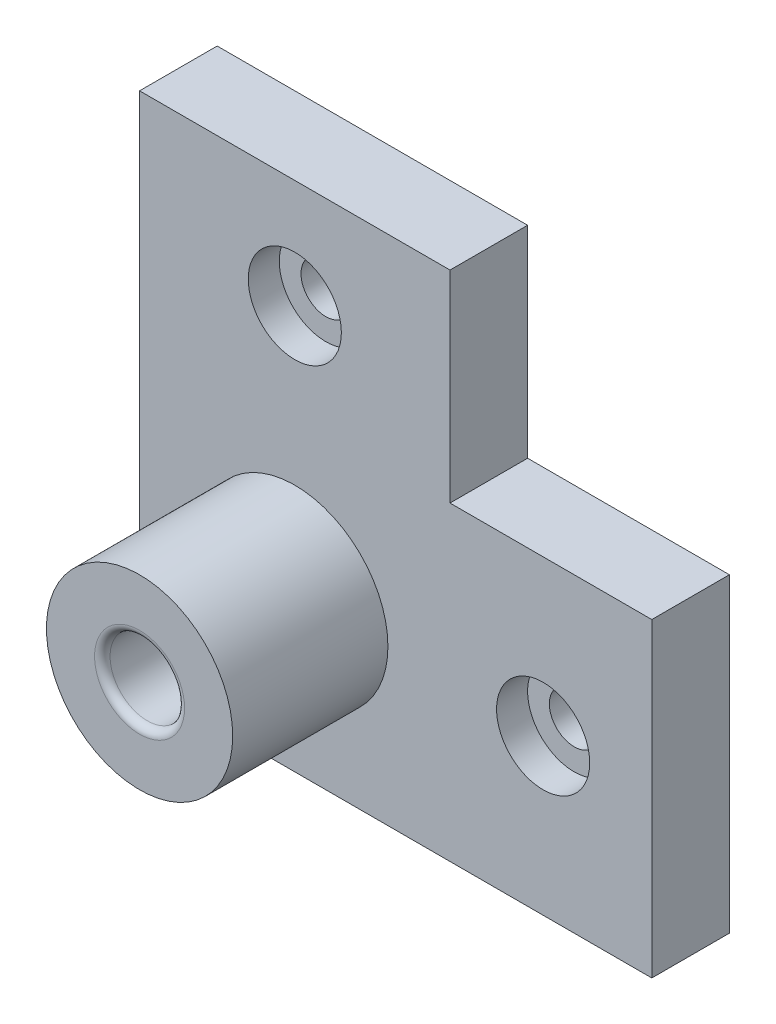
ISO-10303-21;
HEADER;
FILE_DESCRIPTION(('STEP AP214'),'2;1');
FILE_NAME('part.step','',(''),(''),'','','');
FILE_SCHEMA(('AUTOMOTIVE_DESIGN { 1 0 10303 214 1 1 1 1 }'));
ENDSEC;
DATA;
#1=APPLICATION_CONTEXT('core data for automotive mechanical design processes');
#2=APPLICATION_PROTOCOL_DEFINITION('international standard','automotive_design',2000,#1);
#3=PRODUCT_CONTEXT('',#1,'mechanical');
#4=PRODUCT('Part','Part','',(#3));
#5=PRODUCT_RELATED_PRODUCT_CATEGORY('part','',(#4));
#6=PRODUCT_DEFINITION_FORMATION('','',#4);
#7=PRODUCT_DEFINITION_CONTEXT('part definition',#1,'design');
#8=PRODUCT_DEFINITION('design','',#6,#7);
#9=PRODUCT_DEFINITION_SHAPE('','',#8);
#10=(LENGTH_UNIT() NAMED_UNIT(*) SI_UNIT(.MILLI.,.METRE.));
#11=(NAMED_UNIT(*) PLANE_ANGLE_UNIT() SI_UNIT($,.RADIAN.));
#12=(NAMED_UNIT(*) SI_UNIT($,.STERADIAN.) SOLID_ANGLE_UNIT());
#13=UNCERTAINTY_MEASURE_WITH_UNIT(LENGTH_MEASURE(1.E-05),#10,'distance_accuracy_value','');
#14=(GEOMETRIC_REPRESENTATION_CONTEXT(3) GLOBAL_UNCERTAINTY_ASSIGNED_CONTEXT((#13)) GLOBAL_UNIT_ASSIGNED_CONTEXT((#10,
#11,#12)) REPRESENTATION_CONTEXT('',''));
#15=CARTESIAN_POINT('',(0.,0.,0.));
#16=DIRECTION('',(0.,0.,1.));
#17=DIRECTION('',(1.,0.,0.));
#18=AXIS2_PLACEMENT_3D('',#15,#16,#17);
#19=CARTESIAN_POINT('',(26.,10.,5.));
#20=DIRECTION('',(0.,0.,-1.));
#21=DIRECTION('',(-1.,0.,0.));
#22=AXIS2_PLACEMENT_3D('',#19,#20,#21);
#23=CYLINDRICAL_SURFACE('',#22,1.6);
#24=CARTESIAN_POINT('',(26.,10.,0.));
#25=DIRECTION('',(0.,0.,1.));
#26=DIRECTION('',(1.,0.,0.));
#27=AXIS2_PLACEMENT_3D('',#24,#25,#26);
#28=CIRCLE('',#27,1.6);
#29=CARTESIAN_POINT('',(27.6,10.,0.));
#30=VERTEX_POINT('',#29);
#31=EDGE_CURVE('E136',#30,#30,#28,.T.);
#32=ORIENTED_EDGE('',*,*,#31,.F.);
#33=EDGE_LOOP('',(#32));
#34=FACE_BOUND('',#33,.T.);
#35=CARTESIAN_POINT('',(26.,10.,3.));
#36=DIRECTION('',(0.,0.,1.));
#37=DIRECTION('',(1.,0.,0.));
#38=AXIS2_PLACEMENT_3D('',#35,#36,#37);
#39=CIRCLE('',#38,1.6);
#40=CARTESIAN_POINT('',(27.6,10.,3.));
#41=VERTEX_POINT('',#40);
#42=EDGE_CURVE('E154',#41,#41,#39,.T.);
#43=ORIENTED_EDGE('',*,*,#42,.T.);
#44=EDGE_LOOP('',(#43));
#45=FACE_BOUND('',#44,.T.);
#46=ADVANCED_FACE('F36',(#34,#45),#23,.F.);
#47=CARTESIAN_POINT('',(10.,26.,5.));
#48=DIRECTION('',(0.,0.,-1.));
#49=DIRECTION('',(-1.,0.,0.));
#50=AXIS2_PLACEMENT_3D('',#47,#48,#49);
#51=CYLINDRICAL_SURFACE('',#50,1.6);
#52=CARTESIAN_POINT('',(10.,26.,0.));
#53=DIRECTION('',(0.,0.,1.));
#54=DIRECTION('',(1.,0.,0.));
#55=AXIS2_PLACEMENT_3D('',#52,#53,#54);
#56=CIRCLE('',#55,1.6);
#57=CARTESIAN_POINT('',(11.6,26.,0.));
#58=VERTEX_POINT('',#57);
#59=EDGE_CURVE('E139',#58,#58,#56,.T.);
#60=ORIENTED_EDGE('',*,*,#59,.F.);
#61=EDGE_LOOP('',(#60));
#62=FACE_BOUND('',#61,.T.);
#63=CARTESIAN_POINT('',(10.,26.,3.));
#64=DIRECTION('',(0.,0.,1.));
#65=DIRECTION('',(1.,0.,0.));
#66=AXIS2_PLACEMENT_3D('',#63,#64,#65);
#67=CIRCLE('',#66,1.6);
#68=CARTESIAN_POINT('',(11.6,26.,3.));
#69=VERTEX_POINT('',#68);
#70=EDGE_CURVE('E149',#69,#69,#67,.T.);
#71=ORIENTED_EDGE('',*,*,#70,.T.);
#72=EDGE_LOOP('',(#71));
#73=FACE_BOUND('',#72,.T.);
#74=ADVANCED_FACE('F175',(#62,#73),#51,.F.);
#75=CARTESIAN_POINT('',(0.,0.,5.));
#76=DIRECTION('',(0.,0.,1.));
#77=DIRECTION('',(1.,0.,0.));
#78=AXIS2_PLACEMENT_3D('',#75,#76,#77);
#79=PLANE('',#78);
#80=CARTESIAN_POINT('',(26.,10.,5.));
#81=DIRECTION('',(0.,0.,1.));
#82=DIRECTION('',(1.,0.,0.));
#83=AXIS2_PLACEMENT_3D('',#80,#81,#82);
#84=CIRCLE('',#83,3.);
#85=CARTESIAN_POINT('',(29.,10.,5.));
#86=VERTEX_POINT('',#85);
#87=EDGE_CURVE('E229',#86,#86,#84,.T.);
#88=ORIENTED_EDGE('',*,*,#87,.F.);
#89=EDGE_LOOP('',(#88));
#90=FACE_BOUND('',#89,.T.);
#91=CARTESIAN_POINT('',(10.,26.,5.));
#92=DIRECTION('',(0.,0.,1.));
#93=DIRECTION('',(1.,0.,0.));
#94=AXIS2_PLACEMENT_3D('',#91,#92,#93);
#95=CIRCLE('',#94,3.);
#96=CARTESIAN_POINT('',(13.,26.,5.));
#97=VERTEX_POINT('',#96);
#98=EDGE_CURVE('E156',#97,#97,#95,.T.);
#99=ORIENTED_EDGE('',*,*,#98,.F.);
#100=EDGE_LOOP('',(#99));
#101=FACE_BOUND('',#100,.T.);
#102=DIRECTION('',(1.,0.,0.));
#103=VECTOR('',#102,1.);
#104=CARTESIAN_POINT('',(0.,20.,5.));
#105=LINE('',#104,#103);
#106=CARTESIAN_POINT('',(20.,20.,5.));
#107=VERTEX_POINT('',#106);
#108=CARTESIAN_POINT('',(33.,20.,5.));
#109=VERTEX_POINT('',#108);
#110=EDGE_CURVE('E142',#107,#109,#105,.T.);
#111=ORIENTED_EDGE('',*,*,#110,.F.);
#112=DIRECTION('',(0.,1.,0.));
#113=VECTOR('',#112,1.);
#114=CARTESIAN_POINT('',(20.,0.,5.));
#115=LINE('',#114,#113);
#116=CARTESIAN_POINT('',(20.,33.,5.));
#117=VERTEX_POINT('',#116);
#118=EDGE_CURVE('E117',#107,#117,#115,.T.);
#119=ORIENTED_EDGE('',*,*,#118,.T.);
#120=DIRECTION('',(1.,0.,0.));
#121=VECTOR('',#120,1.);
#122=CARTESIAN_POINT('',(0.,33.,5.));
#123=LINE('',#122,#121);
#124=CARTESIAN_POINT('',(0.,33.,5.));
#125=VERTEX_POINT('',#124);
#126=EDGE_CURVE('E115',#125,#117,#123,.T.);
#127=ORIENTED_EDGE('',*,*,#126,.F.);
#128=DIRECTION('',(0.,1.,0.));
#129=VECTOR('',#128,1.);
#130=CARTESIAN_POINT('',(0.,0.,5.));
#131=LINE('',#130,#129);
#132=CARTESIAN_POINT('',(0.,0.,5.));
#133=VERTEX_POINT('',#132);
#134=EDGE_CURVE('E102',#133,#125,#131,.T.);
#135=ORIENTED_EDGE('',*,*,#134,.F.);
#136=DIRECTION('',(1.,0.,0.));
#137=VECTOR('',#136,1.);
#138=CARTESIAN_POINT('',(0.,0.,5.));
#139=LINE('',#138,#137);
#140=CARTESIAN_POINT('',(33.,0.,5.));
#141=VERTEX_POINT('',#140);
#142=EDGE_CURVE('E108',#133,#141,#139,.T.);
#143=ORIENTED_EDGE('',*,*,#142,.T.);
#144=DIRECTION('',(0.,1.,0.));
#145=VECTOR('',#144,1.);
#146=CARTESIAN_POINT('',(33.,0.,5.));
#147=LINE('',#146,#145);
#148=EDGE_CURVE('E53',#141,#109,#147,.T.);
#149=ORIENTED_EDGE('',*,*,#148,.T.);
#150=EDGE_LOOP('',(#111,#119,#127,#135,#143,#149));
#151=FACE_BOUND('',#150,.T.);
#152=CARTESIAN_POINT('',(9.99999999999545,9.99999999999999,5.));
#153=DIRECTION('',(0.,0.,1.));
#154=DIRECTION('',(1.,0.,0.));
#155=AXIS2_PLACEMENT_3D('',#152,#153,#154);
#156=CIRCLE('',#155,6.);
#157=CARTESIAN_POINT('',(15.9999999999955,9.99999999999999,5.));
#158=VERTEX_POINT('',#157);
#159=EDGE_CURVE('E218',#158,#158,#156,.T.);
#160=ORIENTED_EDGE('',*,*,#159,.F.);
#161=EDGE_LOOP('',(#160));
#162=FACE_BOUND('',#161,.T.);
#163=ADVANCED_FACE('F112',(#90,#101,#151,#162),#79,.T.);
#164=CARTESIAN_POINT('',(0.,20.,5.));
#165=DIRECTION('',(0.,1.,0.));
#166=DIRECTION('',(0.,0.,1.));
#167=AXIS2_PLACEMENT_3D('',#164,#165,#166);
#168=PLANE('',#167);
#169=DIRECTION('',(1.,0.,0.));
#170=VECTOR('',#169,1.);
#171=CARTESIAN_POINT('',(0.,20.,0.));
#172=LINE('',#171,#170);
#173=CARTESIAN_POINT('',(20.,20.,0.));
#174=VERTEX_POINT('',#173);
#175=CARTESIAN_POINT('',(33.,20.,0.));
#176=VERTEX_POINT('',#175);
#177=EDGE_CURVE('E122',#174,#176,#172,.T.);
#178=ORIENTED_EDGE('',*,*,#177,.F.);
#179=DIRECTION('',(0.,0.,-1.));
#180=VECTOR('',#179,1.);
#181=CARTESIAN_POINT('',(20.,20.,5.));
#182=LINE('',#181,#180);
#183=EDGE_CURVE('E87',#107,#174,#182,.T.);
#184=ORIENTED_EDGE('',*,*,#183,.F.);
#185=ORIENTED_EDGE('',*,*,#110,.T.);
#186=DIRECTION('',(0.,0.,-1.));
#187=VECTOR('',#186,1.);
#188=CARTESIAN_POINT('',(33.,20.,5.));
#189=LINE('',#188,#187);
#190=EDGE_CURVE('E82',#109,#176,#189,.T.);
#191=ORIENTED_EDGE('',*,*,#190,.T.);
#192=EDGE_LOOP('',(#178,#184,#185,#191));
#193=FACE_BOUND('',#192,.T.);
#194=ADVANCED_FACE('F202',(#193),#168,.T.);
#195=CARTESIAN_POINT('',(20.,0.,5.));
#196=DIRECTION('',(-1.,0.,0.));
#197=DIRECTION('',(0.,0.,1.));
#198=AXIS2_PLACEMENT_3D('',#195,#196,#197);
#199=PLANE('',#198);
#200=DIRECTION('',(0.,1.,0.));
#201=VECTOR('',#200,1.);
#202=CARTESIAN_POINT('',(20.,0.,0.));
#203=LINE('',#202,#201);
#204=CARTESIAN_POINT('',(20.,33.,0.));
#205=VERTEX_POINT('',#204);
#206=EDGE_CURVE('E125',#174,#205,#203,.T.);
#207=ORIENTED_EDGE('',*,*,#206,.T.);
#208=DIRECTION('',(0.,0.,-1.));
#209=VECTOR('',#208,1.);
#210=CARTESIAN_POINT('',(20.,33.,5.));
#211=LINE('',#210,#209);
#212=EDGE_CURVE('E146',#117,#205,#211,.T.);
#213=ORIENTED_EDGE('',*,*,#212,.F.);
#214=ORIENTED_EDGE('',*,*,#118,.F.);
#215=ORIENTED_EDGE('',*,*,#183,.T.);
#216=EDGE_LOOP('',(#207,#213,#214,#215));
#217=FACE_BOUND('',#216,.T.);
#218=ADVANCED_FACE('F199',(#217),#199,.F.);
#219=CARTESIAN_POINT('',(0.,33.,5.));
#220=DIRECTION('',(0.,1.,0.));
#221=DIRECTION('',(0.,0.,1.));
#222=AXIS2_PLACEMENT_3D('',#219,#220,#221);
#223=PLANE('',#222);
#224=DIRECTION('',(1.,0.,0.));
#225=VECTOR('',#224,1.);
#226=CARTESIAN_POINT('',(0.,33.,0.));
#227=LINE('',#226,#225);
#228=CARTESIAN_POINT('',(0.,33.,0.));
#229=VERTEX_POINT('',#228);
#230=EDGE_CURVE('E129',#229,#205,#227,.T.);
#231=ORIENTED_EDGE('',*,*,#230,.F.);
#232=DIRECTION('',(0.,0.,-1.));
#233=VECTOR('',#232,1.);
#234=CARTESIAN_POINT('',(0.,33.,5.));
#235=LINE('',#234,#233);
#236=EDGE_CURVE('E105',#125,#229,#235,.T.);
#237=ORIENTED_EDGE('',*,*,#236,.F.);
#238=ORIENTED_EDGE('',*,*,#126,.T.);
#239=ORIENTED_EDGE('',*,*,#212,.T.);
#240=EDGE_LOOP('',(#231,#237,#238,#239));
#241=FACE_BOUND('',#240,.T.);
#242=ADVANCED_FACE('F196',(#241),#223,.T.);
#243=CARTESIAN_POINT('',(0.,0.,5.));
#244=DIRECTION('',(-1.,0.,0.));
#245=DIRECTION('',(0.,0.,1.));
#246=AXIS2_PLACEMENT_3D('',#243,#244,#245);
#247=PLANE('',#246);
#248=DIRECTION('',(0.,1.,0.));
#249=VECTOR('',#248,1.);
#250=CARTESIAN_POINT('',(0.,0.,0.));
#251=LINE('',#250,#249);
#252=CARTESIAN_POINT('',(0.,0.,0.));
#253=VERTEX_POINT('',#252);
#254=EDGE_CURVE('E104',#253,#229,#251,.T.);
#255=ORIENTED_EDGE('',*,*,#254,.F.);
#256=DIRECTION('',(0.,0.,-1.));
#257=VECTOR('',#256,1.);
#258=CARTESIAN_POINT('',(0.,0.,5.));
#259=LINE('',#258,#257);
#260=EDGE_CURVE('E98',#133,#253,#259,.T.);
#261=ORIENTED_EDGE('',*,*,#260,.F.);
#262=ORIENTED_EDGE('',*,*,#134,.T.);
#263=ORIENTED_EDGE('',*,*,#236,.T.);
#264=EDGE_LOOP('',(#255,#261,#262,#263));
#265=FACE_BOUND('',#264,.T.);
#266=ADVANCED_FACE('F100',(#265),#247,.T.);
#267=CARTESIAN_POINT('',(0.,0.,5.));
#268=DIRECTION('',(0.,1.,0.));
#269=DIRECTION('',(0.,0.,1.));
#270=AXIS2_PLACEMENT_3D('',#267,#268,#269);
#271=PLANE('',#270);
#272=DIRECTION('',(1.,0.,0.));
#273=VECTOR('',#272,1.);
#274=CARTESIAN_POINT('',(0.,0.,0.));
#275=LINE('',#274,#273);
#276=CARTESIAN_POINT('',(33.,0.,0.));
#277=VERTEX_POINT('',#276);
#278=EDGE_CURVE('E75',#253,#277,#275,.T.);
#279=ORIENTED_EDGE('',*,*,#278,.T.);
#280=DIRECTION('',(0.,0.,-1.));
#281=VECTOR('',#280,1.);
#282=CARTESIAN_POINT('',(33.,0.,5.));
#283=LINE('',#282,#281);
#284=EDGE_CURVE('E106',#141,#277,#283,.T.);
#285=ORIENTED_EDGE('',*,*,#284,.F.);
#286=ORIENTED_EDGE('',*,*,#142,.F.);
#287=ORIENTED_EDGE('',*,*,#260,.T.);
#288=EDGE_LOOP('',(#279,#285,#286,#287));
#289=FACE_BOUND('',#288,.T.);
#290=ADVANCED_FACE('F109',(#289),#271,.F.);
#291=CARTESIAN_POINT('',(33.,0.,5.));
#292=DIRECTION('',(-1.,0.,0.));
#293=DIRECTION('',(0.,0.,1.));
#294=AXIS2_PLACEMENT_3D('',#291,#292,#293);
#295=PLANE('',#294);
#296=DIRECTION('',(0.,1.,0.));
#297=VECTOR('',#296,1.);
#298=CARTESIAN_POINT('',(33.,0.,0.));
#299=LINE('',#298,#297);
#300=EDGE_CURVE('E134',#277,#176,#299,.T.);
#301=ORIENTED_EDGE('',*,*,#300,.T.);
#302=ORIENTED_EDGE('',*,*,#190,.F.);
#303=ORIENTED_EDGE('',*,*,#148,.F.);
#304=ORIENTED_EDGE('',*,*,#284,.T.);
#305=EDGE_LOOP('',(#301,#302,#303,#304));
#306=FACE_BOUND('',#305,.T.);
#307=ADVANCED_FACE('F187',(#306),#295,.F.);
#308=CARTESIAN_POINT('',(0.,0.,0.));
#309=DIRECTION('',(0.,0.,1.));
#310=DIRECTION('',(1.,0.,0.));
#311=AXIS2_PLACEMENT_3D('',#308,#309,#310);
#312=PLANE('',#311);
#313=CARTESIAN_POINT('',(9.99999999999545,9.99999999999999,0.));
#314=DIRECTION('',(0.,0.,1.));
#315=DIRECTION('',(1.,0.,0.));
#316=AXIS2_PLACEMENT_3D('',#313,#314,#315);
#317=CIRCLE('',#316,2.4);
#318=CARTESIAN_POINT('',(12.3999999999955,9.99999999999999,0.));
#319=VERTEX_POINT('',#318);
#320=EDGE_CURVE('E152',#319,#319,#317,.T.);
#321=ORIENTED_EDGE('',*,*,#320,.T.);
#322=EDGE_LOOP('',(#321));
#323=FACE_BOUND('',#322,.T.);
#324=ORIENTED_EDGE('',*,*,#177,.T.);
#325=ORIENTED_EDGE('',*,*,#300,.F.);
#326=ORIENTED_EDGE('',*,*,#278,.F.);
#327=ORIENTED_EDGE('',*,*,#254,.T.);
#328=ORIENTED_EDGE('',*,*,#230,.T.);
#329=ORIENTED_EDGE('',*,*,#206,.F.);
#330=EDGE_LOOP('',(#324,#325,#326,#327,#328,#329));
#331=FACE_BOUND('',#330,.T.);
#332=ORIENTED_EDGE('',*,*,#31,.T.);
#333=EDGE_LOOP('',(#332));
#334=FACE_BOUND('',#333,.T.);
#335=ORIENTED_EDGE('',*,*,#59,.T.);
#336=EDGE_LOOP('',(#335));
#337=FACE_BOUND('',#336,.T.);
#338=ADVANCED_FACE('F190',(#323,#331,#334,#337),#312,.F.);
#339=CARTESIAN_POINT('',(9.99999999999545,9.99999999999999,15.));
#340=DIRECTION('',(0.,0.,-1.));
#341=DIRECTION('',(-1.,0.,0.));
#342=AXIS2_PLACEMENT_3D('',#339,#340,#341);
#343=CYLINDRICAL_SURFACE('',#342,6.);
#344=CARTESIAN_POINT('',(9.99999999999545,9.99999999999999,15.));
#345=DIRECTION('',(0.,0.,1.));
#346=DIRECTION('',(1.,0.,0.));
#347=AXIS2_PLACEMENT_3D('',#344,#345,#346);
#348=CIRCLE('',#347,6.);
#349=CARTESIAN_POINT('',(15.9999999999955,9.99999999999999,15.));
#350=VERTEX_POINT('',#349);
#351=EDGE_CURVE('E126',#350,#350,#348,.T.);
#352=ORIENTED_EDGE('',*,*,#351,.F.);
#353=EDGE_LOOP('',(#352));
#354=FACE_BOUND('',#353,.T.);
#355=ORIENTED_EDGE('',*,*,#159,.T.);
#356=EDGE_LOOP('',(#355));
#357=FACE_BOUND('',#356,.T.);
#358=ADVANCED_FACE('F260',(#354,#357),#343,.T.);
#359=CARTESIAN_POINT('',(9.99999999999545,9.99999999999999,15.));
#360=DIRECTION('',(0.,0.,1.));
#361=DIRECTION('',(1.,0.,0.));
#362=AXIS2_PLACEMENT_3D('',#359,#360,#361);
#363=PLANE('',#362);
#364=CARTESIAN_POINT('',(9.99999999999545,9.99999999999999,15.));
#365=DIRECTION('',(0.,0.,1.));
#366=DIRECTION('',(1.,0.,0.));
#367=AXIS2_PLACEMENT_3D('',#364,#365,#366);
#368=CIRCLE('',#367,2.9);
#369=CARTESIAN_POINT('',(12.8999999999955,9.99999999999999,15.));
#370=VERTEX_POINT('',#369);
#371=EDGE_CURVE('E11',#370,#370,#368,.F.);
#372=ORIENTED_EDGE('',*,*,#371,.T.);
#373=EDGE_LOOP('',(#372));
#374=FACE_BOUND('',#373,.T.);
#375=ORIENTED_EDGE('',*,*,#351,.T.);
#376=EDGE_LOOP('',(#375));
#377=FACE_BOUND('',#376,.T.);
#378=ADVANCED_FACE('F254',(#374,#377),#363,.T.);
#379=CARTESIAN_POINT('',(9.99999999999545,9.99999999999999,0.));
#380=DIRECTION('',(0.,0.,1.));
#381=DIRECTION('',(1.,0.,0.));
#382=AXIS2_PLACEMENT_3D('',#379,#380,#381);
#383=CYLINDRICAL_SURFACE('',#382,2.4);
#384=CARTESIAN_POINT('',(9.99999999999545,9.99999999999999,14.5));
#385=DIRECTION('',(0.,0.,1.));
#386=DIRECTION('',(1.,0.,0.));
#387=AXIS2_PLACEMENT_3D('',#384,#385,#386);
#388=CIRCLE('',#387,2.4);
#389=CARTESIAN_POINT('',(12.3999999999955,9.99999999999999,14.5));
#390=VERTEX_POINT('',#389);
#391=EDGE_CURVE('E45',#390,#390,#388,.T.);
#392=ORIENTED_EDGE('',*,*,#391,.T.);
#393=EDGE_LOOP('',(#392));
#394=FACE_BOUND('',#393,.T.);
#395=ORIENTED_EDGE('',*,*,#320,.F.);
#396=EDGE_LOOP('',(#395));
#397=FACE_BOUND('',#396,.T.);
#398=ADVANCED_FACE('F161',(#394,#397),#383,.F.);
#399=CARTESIAN_POINT('',(10.,26.,3.));
#400=DIRECTION('',(0.,0.,1.));
#401=DIRECTION('',(1.,0.,0.));
#402=AXIS2_PLACEMENT_3D('',#399,#400,#401);
#403=CYLINDRICAL_SURFACE('',#402,3.);
#404=CARTESIAN_POINT('',(10.,26.,3.));
#405=DIRECTION('',(0.,0.,1.));
#406=DIRECTION('',(1.,0.,0.));
#407=AXIS2_PLACEMENT_3D('',#404,#405,#406);
#408=CIRCLE('',#407,3.);
#409=CARTESIAN_POINT('',(13.,26.,3.));
#410=VERTEX_POINT('',#409);
#411=EDGE_CURVE('E153',#410,#410,#408,.T.);
#412=ORIENTED_EDGE('',*,*,#411,.F.);
#413=EDGE_LOOP('',(#412));
#414=FACE_BOUND('',#413,.T.);
#415=ORIENTED_EDGE('',*,*,#98,.T.);
#416=EDGE_LOOP('',(#415));
#417=FACE_BOUND('',#416,.T.);
#418=ADVANCED_FACE('F244',(#414,#417),#403,.F.);
#419=CARTESIAN_POINT('',(10.,26.,3.));
#420=DIRECTION('',(0.,0.,1.));
#421=DIRECTION('',(1.,0.,0.));
#422=AXIS2_PLACEMENT_3D('',#419,#420,#421);
#423=PLANE('',#422);
#424=ORIENTED_EDGE('',*,*,#70,.F.);
#425=EDGE_LOOP('',(#424));
#426=FACE_BOUND('',#425,.T.);
#427=ORIENTED_EDGE('',*,*,#411,.T.);
#428=EDGE_LOOP('',(#427));
#429=FACE_BOUND('',#428,.T.);
#430=ADVANCED_FACE('F238',(#426,#429),#423,.T.);
#431=CARTESIAN_POINT('',(26.,10.,3.));
#432=DIRECTION('',(0.,0.,1.));
#433=DIRECTION('',(1.,0.,0.));
#434=AXIS2_PLACEMENT_3D('',#431,#432,#433);
#435=CYLINDRICAL_SURFACE('',#434,3.);
#436=CARTESIAN_POINT('',(26.,10.,3.));
#437=DIRECTION('',(0.,0.,1.));
#438=DIRECTION('',(1.,0.,0.));
#439=AXIS2_PLACEMENT_3D('',#436,#437,#438);
#440=CIRCLE('',#439,3.);
#441=CARTESIAN_POINT('',(29.,10.,3.));
#442=VERTEX_POINT('',#441);
#443=EDGE_CURVE('E157',#442,#442,#440,.T.);
#444=ORIENTED_EDGE('',*,*,#443,.F.);
#445=EDGE_LOOP('',(#444));
#446=FACE_BOUND('',#445,.T.);
#447=ORIENTED_EDGE('',*,*,#87,.T.);
#448=EDGE_LOOP('',(#447));
#449=FACE_BOUND('',#448,.T.);
#450=ADVANCED_FACE('F170',(#446,#449),#435,.F.);
#451=CARTESIAN_POINT('',(26.,10.,3.));
#452=DIRECTION('',(0.,0.,1.));
#453=DIRECTION('',(1.,0.,0.));
#454=AXIS2_PLACEMENT_3D('',#451,#452,#453);
#455=PLANE('',#454);
#456=ORIENTED_EDGE('',*,*,#42,.F.);
#457=EDGE_LOOP('',(#456));
#458=FACE_BOUND('',#457,.T.);
#459=ORIENTED_EDGE('',*,*,#443,.T.);
#460=EDGE_LOOP('',(#459));
#461=FACE_BOUND('',#460,.T.);
#462=ADVANCED_FACE('F165',(#458,#461),#455,.T.);
#463=CARTESIAN_POINT('',(9.99999999999545,9.99999999999999,14.5));
#464=DIRECTION('',(0.,0.,1.));
#465=DIRECTION('',(1.,0.,0.));
#466=AXIS2_PLACEMENT_3D('',#463,#464,#465);
#467=TOROIDAL_SURFACE('',#466,2.9,0.5);
#468=ORIENTED_EDGE('',*,*,#371,.F.);
#469=EDGE_LOOP('',(#468));
#470=FACE_BOUND('',#469,.T.);
#471=ORIENTED_EDGE('',*,*,#391,.F.);
#472=EDGE_LOOP('',(#471));
#473=FACE_BOUND('',#472,.T.);
#474=ADVANCED_FACE('F38',(#470,#473),#467,.T.);
#475=CLOSED_SHELL('',(#46,#74,#163,#194,#218,#242,#266,#290,#307,#338,#358,#378,#398,#418,#430,
#450,#462,#474));
#476=MANIFOLD_SOLID_BREP('B2',#475);
#477=ADVANCED_BREP_SHAPE_REPRESENTATION('',(#18,#476),#14);
#478=SHAPE_DEFINITION_REPRESENTATION(#9,#477);
ENDSEC;
END-ISO-10303-21;
